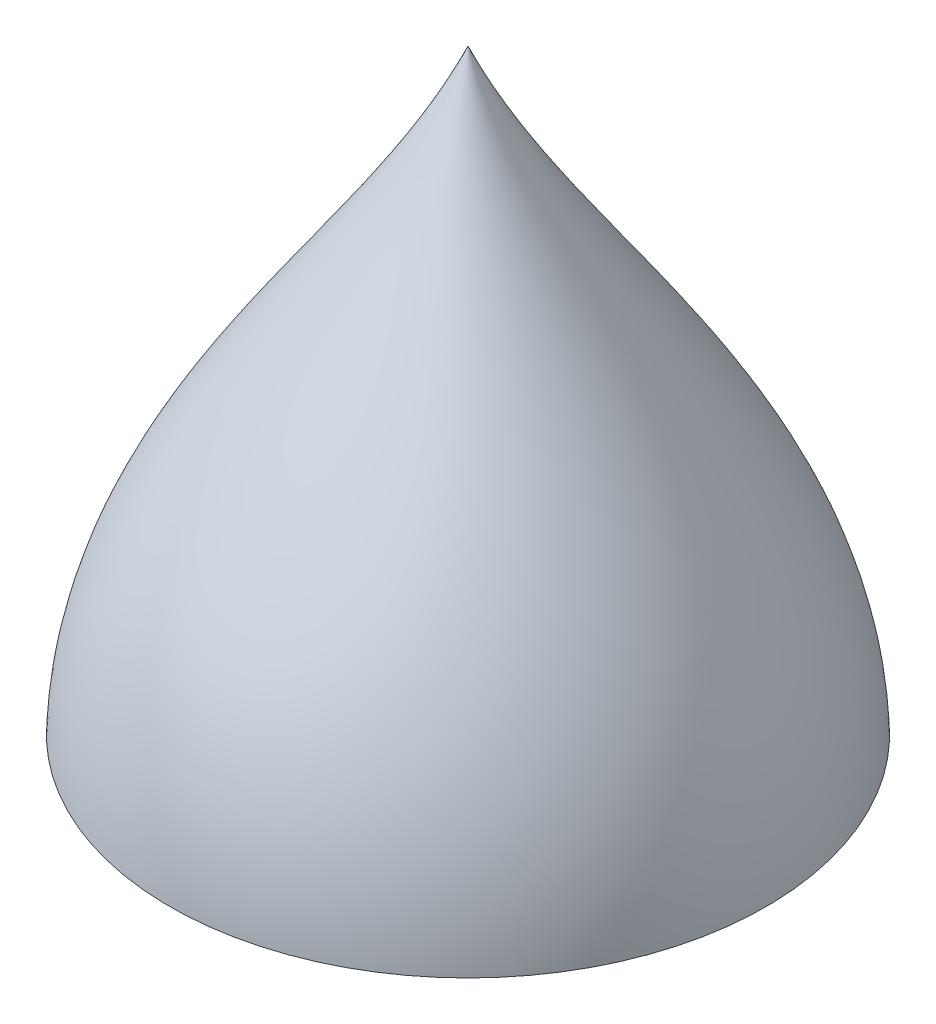
ISO-10303-21;
HEADER;
FILE_DESCRIPTION(('STEP AP214'),'2;1');
FILE_NAME('part.step','',(''),(''),'','','');
FILE_SCHEMA(('AUTOMOTIVE_DESIGN { 1 0 10303 214 1 1 1 1 }'));
ENDSEC;
DATA;
#1=APPLICATION_CONTEXT('core data for automotive mechanical design processes');
#2=APPLICATION_PROTOCOL_DEFINITION('international standard','automotive_design',2000,#1);
#3=PRODUCT_CONTEXT('',#1,'mechanical');
#4=PRODUCT('Part','Part','',(#3));
#5=PRODUCT_RELATED_PRODUCT_CATEGORY('part','',(#4));
#6=PRODUCT_DEFINITION_FORMATION('','',#4);
#7=PRODUCT_DEFINITION_CONTEXT('part definition',#1,'design');
#8=PRODUCT_DEFINITION('design','',#6,#7);
#9=PRODUCT_DEFINITION_SHAPE('','',#8);
#10=(LENGTH_UNIT() NAMED_UNIT(*) SI_UNIT(.MILLI.,.METRE.));
#11=(NAMED_UNIT(*) PLANE_ANGLE_UNIT() SI_UNIT($,.RADIAN.));
#12=(NAMED_UNIT(*) SI_UNIT($,.STERADIAN.) SOLID_ANGLE_UNIT());
#13=UNCERTAINTY_MEASURE_WITH_UNIT(LENGTH_MEASURE(1.E-05),#10,'distance_accuracy_value','');
#14=(GEOMETRIC_REPRESENTATION_CONTEXT(3) GLOBAL_UNCERTAINTY_ASSIGNED_CONTEXT((#13)) GLOBAL_UNIT_ASSIGNED_CONTEXT((#10,
#11,#12)) REPRESENTATION_CONTEXT('',''));
#15=CARTESIAN_POINT('',(0.,0.,0.));
#16=DIRECTION('',(0.,0.,1.));
#17=DIRECTION('',(1.,0.,0.));
#18=AXIS2_PLACEMENT_3D('',#15,#16,#17);
#19=CARTESIAN_POINT('',(0.,8.,0.));
#20=CARTESIAN_POINT('',(-1.17686055224756,5.3229272232192,0.));
#21=CARTESIAN_POINT('',(-3.88674661403719,3.1200718967513,0.));
#22=CARTESIAN_POINT('',(-4.,0.,0.));
#23=B_SPLINE_CURVE_WITH_KNOTS('',3,(#19,#20,#21,#22),.UNSPECIFIED.,.F.,.F.,(4,4),(0.,1.),.UNSPECIFIED.);
#24=CARTESIAN_POINT('',(0.,0.,0.));
#25=DIRECTION('',(0.,-1.,0.));
#26=AXIS1_PLACEMENT('',#24,#25);
#27=SURFACE_OF_REVOLUTION('',#23,#26);
#28=CARTESIAN_POINT('',(0.,0.,0.));
#29=DIRECTION('',(0.,-1.,0.));
#30=DIRECTION('',(0.,0.,-1.));
#31=AXIS2_PLACEMENT_3D('',#28,#29,#30);
#32=CIRCLE('',#31,4.);
#33=CARTESIAN_POINT('',(0.,0.,-4.));
#34=VERTEX_POINT('',#33);
#35=EDGE_CURVE('E11',#34,#34,#32,.T.);
#36=ORIENTED_EDGE('',*,*,#35,.F.);
#37=EDGE_LOOP('',(#36));
#38=FACE_BOUND('',#37,.T.);
#39=CARTESIAN_POINT('',(0.,8.,0.));
#40=VERTEX_POINT('',#39);
#41=VERTEX_LOOP('',#40);
#42=FACE_BOUND('',#41,.T.);
#43=ADVANCED_FACE('F36',(#38,#42),#27,.T.);
#44=CARTESIAN_POINT('',(-4.,0.,0.));
#45=DIRECTION('',(0.,1.,0.));
#46=DIRECTION('',(0.,0.,1.));
#47=AXIS2_PLACEMENT_3D('',#44,#45,#46);
#48=PLANE('',#47);
#49=CARTESIAN_POINT('',(0.,0.,0.));
#50=DIRECTION('',(0.,-1.,0.));
#51=DIRECTION('',(0.,0.,-1.));
#52=AXIS2_PLACEMENT_3D('',#49,#50,#51);
#53=CIRCLE('',#52,3.1);
#54=CARTESIAN_POINT('',(0.,0.,-3.1));
#55=VERTEX_POINT('',#54);
#56=EDGE_CURVE('E44',#55,#55,#53,.T.);
#57=ORIENTED_EDGE('',*,*,#56,.F.);
#58=EDGE_LOOP('',(#57));
#59=FACE_BOUND('',#58,.T.);
#60=ORIENTED_EDGE('',*,*,#35,.T.);
#61=EDGE_LOOP('',(#60));
#62=FACE_BOUND('',#61,.T.);
#63=ADVANCED_FACE('F49',(#59,#62),#48,.F.);
#64=CARTESIAN_POINT('',(0.,0.,0.));
#65=DIRECTION('',(0.,-1.,0.));
#66=DIRECTION('',(0.,0.,-1.));
#67=AXIS2_PLACEMENT_3D('',#64,#65,#66);
#68=CYLINDRICAL_SURFACE('',#67,3.1);
#69=CARTESIAN_POINT('',(0.,1.,0.));
#70=DIRECTION('',(0.,-1.,0.));
#71=DIRECTION('',(0.,0.,-1.));
#72=AXIS2_PLACEMENT_3D('',#69,#70,#71);
#73=CIRCLE('',#72,3.1);
#74=CARTESIAN_POINT('',(0.,1.,-3.1));
#75=VERTEX_POINT('',#74);
#76=EDGE_CURVE('E87',#75,#75,#73,.T.);
#77=ORIENTED_EDGE('',*,*,#76,.F.);
#78=EDGE_LOOP('',(#77));
#79=FACE_BOUND('',#78,.T.);
#80=ORIENTED_EDGE('',*,*,#56,.T.);
#81=EDGE_LOOP('',(#80));
#82=FACE_BOUND('',#81,.T.);
#83=ADVANCED_FACE('F54',(#79,#82),#68,.F.);
#84=CARTESIAN_POINT('',(-3.1,1.,0.));
#85=DIRECTION('',(0.,1.,0.));
#86=DIRECTION('',(0.,0.,1.));
#87=AXIS2_PLACEMENT_3D('',#84,#85,#86);
#88=PLANE('',#87);
#89=CARTESIAN_POINT('',(0.,1.,0.));
#90=DIRECTION('',(0.,-1.,0.));
#91=DIRECTION('',(0.,0.,-1.));
#92=AXIS2_PLACEMENT_3D('',#89,#90,#91);
#93=CIRCLE('',#92,2.);
#94=CARTESIAN_POINT('',(0.,1.,-2.));
#95=VERTEX_POINT('',#94);
#96=EDGE_CURVE('E82',#95,#95,#93,.T.);
#97=ORIENTED_EDGE('',*,*,#96,.F.);
#98=EDGE_LOOP('',(#97));
#99=FACE_BOUND('',#98,.T.);
#100=ORIENTED_EDGE('',*,*,#76,.T.);
#101=EDGE_LOOP('',(#100));
#102=FACE_BOUND('',#101,.T.);
#103=ADVANCED_FACE('F61',(#99,#102),#88,.F.);
#104=CARTESIAN_POINT('',(0.,0.,0.));
#105=DIRECTION('',(0.,-1.,0.));
#106=DIRECTION('',(0.,0.,-1.));
#107=AXIS2_PLACEMENT_3D('',#104,#105,#106);
#108=CYLINDRICAL_SURFACE('',#107,2.);
#109=CARTESIAN_POINT('',(0.,0.,0.));
#110=DIRECTION('',(0.,-1.,0.));
#111=DIRECTION('',(0.,0.,-1.));
#112=AXIS2_PLACEMENT_3D('',#109,#110,#111);
#113=CIRCLE('',#112,2.);
#114=CARTESIAN_POINT('',(0.,0.,-2.));
#115=VERTEX_POINT('',#114);
#116=EDGE_CURVE('E80',#115,#115,#113,.T.);
#117=ORIENTED_EDGE('',*,*,#116,.F.);
#118=EDGE_LOOP('',(#117));
#119=FACE_BOUND('',#118,.T.);
#120=ORIENTED_EDGE('',*,*,#96,.T.);
#121=EDGE_LOOP('',(#120));
#122=FACE_BOUND('',#121,.T.);
#123=ADVANCED_FACE('F68',(#119,#122),#108,.T.);
#124=CARTESIAN_POINT('',(-2.,0.,0.));
#125=DIRECTION('',(0.,1.,0.));
#126=DIRECTION('',(0.,0.,1.));
#127=AXIS2_PLACEMENT_3D('',#124,#125,#126);
#128=PLANE('',#127);
#129=ORIENTED_EDGE('',*,*,#116,.T.);
#130=EDGE_LOOP('',(#129));
#131=FACE_BOUND('',#130,.T.);
#132=ADVANCED_FACE('F72',(#131),#128,.F.);
#133=CLOSED_SHELL('',(#43,#63,#83,#103,#123,#132));
#134=MANIFOLD_SOLID_BREP('B2',#133);
#135=ADVANCED_BREP_SHAPE_REPRESENTATION('',(#18,#134),#14);
#136=SHAPE_DEFINITION_REPRESENTATION(#9,#135);
ENDSEC;
END-ISO-10303-21;
